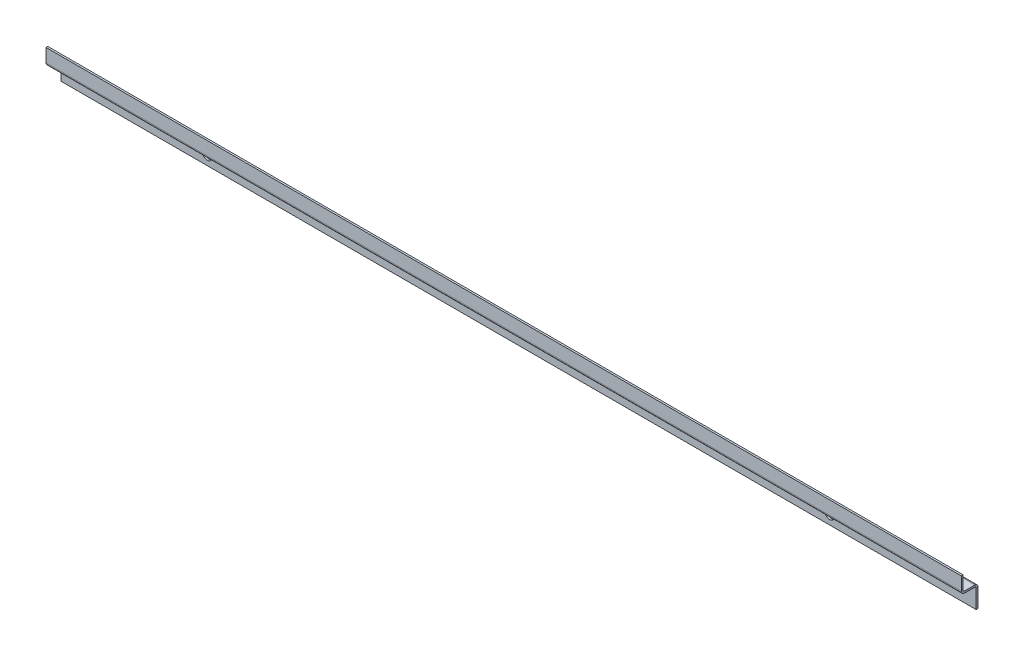
ISO-10303-21;
HEADER;
FILE_DESCRIPTION(('STEP AP214'),'2;1');
FILE_NAME('part.step','',(''),(''),'','','');
FILE_SCHEMA(('AUTOMOTIVE_DESIGN { 1 0 10303 214 1 1 1 1 }'));
ENDSEC;
DATA;
#1=APPLICATION_CONTEXT('core data for automotive mechanical design processes');
#2=APPLICATION_PROTOCOL_DEFINITION('international standard','automotive_design',2000,#1);
#3=PRODUCT_CONTEXT('',#1,'mechanical');
#4=PRODUCT('Part','Part','',(#3));
#5=PRODUCT_RELATED_PRODUCT_CATEGORY('part','',(#4));
#6=PRODUCT_DEFINITION_FORMATION('','',#4);
#7=PRODUCT_DEFINITION_CONTEXT('part definition',#1,'design');
#8=PRODUCT_DEFINITION('design','',#6,#7);
#9=PRODUCT_DEFINITION_SHAPE('','',#8);
#10=(LENGTH_UNIT() NAMED_UNIT(*) SI_UNIT(.MILLI.,.METRE.));
#11=(NAMED_UNIT(*) PLANE_ANGLE_UNIT() SI_UNIT($,.RADIAN.));
#12=(NAMED_UNIT(*) SI_UNIT($,.STERADIAN.) SOLID_ANGLE_UNIT());
#13=UNCERTAINTY_MEASURE_WITH_UNIT(LENGTH_MEASURE(1.E-05),#10,'distance_accuracy_value','');
#14=(GEOMETRIC_REPRESENTATION_CONTEXT(3) GLOBAL_UNCERTAINTY_ASSIGNED_CONTEXT((#13)) GLOBAL_UNIT_ASSIGNED_CONTEXT((#10,
#11,#12)) REPRESENTATION_CONTEXT('',''));
#15=CARTESIAN_POINT('',(0.,0.,0.));
#16=DIRECTION('',(0.,0.,1.));
#17=DIRECTION('',(1.,0.,0.));
#18=AXIS2_PLACEMENT_3D('',#15,#16,#17);
#19=CARTESIAN_POINT('',(500.,4.2634,-4.05));
#20=DIRECTION('',(1.,0.,0.));
#21=DIRECTION('',(0.,0.,-1.));
#22=AXIS2_PLACEMENT_3D('',#19,#20,#21);
#23=PLANE('',#22);
#24=DIRECTION('',(0.,0.,1.));
#25=VECTOR('',#24,1.);
#26=CARTESIAN_POINT('',(500.,4.2634,-4.05));
#27=LINE('',#26,#25);
#28=CARTESIAN_POINT('',(500.,4.2634,-4.05));
#29=VERTEX_POINT('',#28);
#30=CARTESIAN_POINT('',(500.,4.2634,-3.05));
#31=VERTEX_POINT('',#30);
#32=EDGE_CURVE('E11',#29,#31,#27,.T.);
#33=ORIENTED_EDGE('',*,*,#32,.F.);
#34=CARTESIAN_POINT('',(500.,4.2634,-2.3134));
#35=DIRECTION('',(-1.,0.,0.));
#36=DIRECTION('',(0.,0.,1.));
#37=AXIS2_PLACEMENT_3D('',#34,#35,#36);
#38=CIRCLE('',#37,1.7366);
#39=CARTESIAN_POINT('',(500.,6.,-2.3134));
#40=VERTEX_POINT('',#39);
#41=EDGE_CURVE('E145',#29,#40,#38,.F.);
#42=ORIENTED_EDGE('',*,*,#41,.T.);
#43=DIRECTION('',(0.,1.,0.));
#44=VECTOR('',#43,1.);
#45=CARTESIAN_POINT('',(500.,5.,-2.3134));
#46=LINE('',#45,#44);
#47=CARTESIAN_POINT('',(500.,5.,-2.3134));
#48=VERTEX_POINT('',#47);
#49=EDGE_CURVE('E43',#48,#40,#46,.T.);
#50=ORIENTED_EDGE('',*,*,#49,.F.);
#51=CARTESIAN_POINT('',(500.,4.2634,-2.3134));
#52=DIRECTION('',(1.,0.,0.));
#53=DIRECTION('',(0.,0.,-1.));
#54=AXIS2_PLACEMENT_3D('',#51,#52,#53);
#55=CIRCLE('',#54,0.7366);
#56=EDGE_CURVE('E240',#31,#48,#55,.T.);
#57=ORIENTED_EDGE('',*,*,#56,.F.);
#58=EDGE_LOOP('',(#33,#42,#50,#57));
#59=FACE_BOUND('',#58,.T.);
#60=ADVANCED_FACE('F35',(#59),#23,.T.);
#61=CARTESIAN_POINT('',(500.,5.,-2.3134));
#62=DIRECTION('',(1.,0.,0.));
#63=DIRECTION('',(0.,0.,-1.));
#64=AXIS2_PLACEMENT_3D('',#61,#62,#63);
#65=PLANE('',#64);
#66=DIRECTION('',(0.,1.,0.));
#67=VECTOR('',#66,1.);
#68=CARTESIAN_POINT('',(500.,6.,-4.05));
#69=LINE('',#68,#67);
#70=CARTESIAN_POINT('',(500.,-6.,-4.05));
#71=VERTEX_POINT('',#70);
#72=EDGE_CURVE('E150',#71,#29,#69,.T.);
#73=ORIENTED_EDGE('',*,*,#72,.T.);
#74=ORIENTED_EDGE('',*,*,#32,.T.);
#75=DIRECTION('',(0.,1.,0.));
#76=VECTOR('',#75,1.);
#77=CARTESIAN_POINT('',(500.,6.,-3.05));
#78=LINE('',#77,#76);
#79=CARTESIAN_POINT('',(500.,-6.,-3.05));
#80=VERTEX_POINT('',#79);
#81=EDGE_CURVE('E253',#80,#31,#78,.T.);
#82=ORIENTED_EDGE('',*,*,#81,.F.);
#83=DIRECTION('',(0.,0.,1.));
#84=VECTOR('',#83,1.);
#85=CARTESIAN_POINT('',(500.,-6.,-4.05));
#86=LINE('',#85,#84);
#87=EDGE_CURVE('E255',#71,#80,#86,.T.);
#88=ORIENTED_EDGE('',*,*,#87,.F.);
#89=EDGE_LOOP('',(#73,#74,#82,#88));
#90=FACE_BOUND('',#89,.T.);
#91=ADVANCED_FACE('F266',(#90),#65,.T.);
#92=CARTESIAN_POINT('',(0.,6.,-2.3134));
#93=DIRECTION('',(-1.,0.,0.));
#94=DIRECTION('',(0.,0.,1.));
#95=AXIS2_PLACEMENT_3D('',#92,#93,#94);
#96=PLANE('',#95);
#97=DIRECTION('',(0.,-1.,0.));
#98=VECTOR('',#97,1.);
#99=CARTESIAN_POINT('',(0.,6.,-2.3134));
#100=LINE('',#99,#98);
#101=CARTESIAN_POINT('',(0.,6.,-2.3134));
#102=VERTEX_POINT('',#101);
#103=CARTESIAN_POINT('',(0.,5.,-2.3134));
#104=VERTEX_POINT('',#103);
#105=EDGE_CURVE('E143',#102,#104,#100,.T.);
#106=ORIENTED_EDGE('',*,*,#105,.F.);
#107=CARTESIAN_POINT('',(0.,4.2634,-2.3134));
#108=DIRECTION('',(-1.,0.,0.));
#109=DIRECTION('',(0.,0.,1.));
#110=AXIS2_PLACEMENT_3D('',#107,#108,#109);
#111=CIRCLE('',#110,1.7366);
#112=CARTESIAN_POINT('',(0.,4.2634,-4.05));
#113=VERTEX_POINT('',#112);
#114=EDGE_CURVE('E157',#113,#102,#111,.F.);
#115=ORIENTED_EDGE('',*,*,#114,.F.);
#116=DIRECTION('',(0.,0.,-1.));
#117=VECTOR('',#116,1.);
#118=CARTESIAN_POINT('',(0.,4.2634,-3.05));
#119=LINE('',#118,#117);
#120=CARTESIAN_POINT('',(0.,4.2634,-3.05));
#121=VERTEX_POINT('',#120);
#122=EDGE_CURVE('E231',#121,#113,#119,.T.);
#123=ORIENTED_EDGE('',*,*,#122,.F.);
#124=CARTESIAN_POINT('',(0.,4.2634,-2.3134));
#125=DIRECTION('',(1.,0.,0.));
#126=DIRECTION('',(0.,0.,-1.));
#127=AXIS2_PLACEMENT_3D('',#124,#125,#126);
#128=CIRCLE('',#127,0.7366);
#129=EDGE_CURVE('E185',#121,#104,#128,.T.);
#130=ORIENTED_EDGE('',*,*,#129,.T.);
#131=EDGE_LOOP('',(#106,#115,#123,#130));
#132=FACE_BOUND('',#131,.T.);
#133=ADVANCED_FACE('F245',(#132),#96,.T.);
#134=CARTESIAN_POINT('',(0.,4.2634,-3.05));
#135=DIRECTION('',(-1.,0.,0.));
#136=DIRECTION('',(0.,0.,1.));
#137=AXIS2_PLACEMENT_3D('',#134,#135,#136);
#138=PLANE('',#137);
#139=DIRECTION('',(0.,0.,1.));
#140=VECTOR('',#139,1.);
#141=CARTESIAN_POINT('',(0.,6.,4.05));
#142=LINE('',#141,#140);
#143=CARTESIAN_POINT('',(0.,6.,3.3134));
#144=VERTEX_POINT('',#143);
#145=EDGE_CURVE('E198',#102,#144,#142,.T.);
#146=ORIENTED_EDGE('',*,*,#145,.F.);
#147=ORIENTED_EDGE('',*,*,#105,.T.);
#148=DIRECTION('',(0.,0.,-1.));
#149=VECTOR('',#148,1.);
#150=CARTESIAN_POINT('',(0.,5.,4.05));
#151=LINE('',#150,#149);
#152=CARTESIAN_POINT('',(0.,5.,3.3134));
#153=VERTEX_POINT('',#152);
#154=EDGE_CURVE('E183',#104,#153,#151,.F.);
#155=ORIENTED_EDGE('',*,*,#154,.T.);
#156=DIRECTION('',(0.,1.,0.));
#157=VECTOR('',#156,1.);
#158=CARTESIAN_POINT('',(0.,5.,3.3134));
#159=LINE('',#158,#157);
#160=EDGE_CURVE('E92',#153,#144,#159,.T.);
#161=ORIENTED_EDGE('',*,*,#160,.T.);
#162=EDGE_LOOP('',(#146,#147,#155,#161));
#163=FACE_BOUND('',#162,.T.);
#164=ADVANCED_FACE('F233',(#163),#138,.T.);
#165=CARTESIAN_POINT('',(500.,6.,3.3134));
#166=DIRECTION('',(1.,0.,0.));
#167=DIRECTION('',(0.,0.,-1.));
#168=AXIS2_PLACEMENT_3D('',#165,#166,#167);
#169=PLANE('',#168);
#170=DIRECTION('',(0.,-1.,0.));
#171=VECTOR('',#170,1.);
#172=CARTESIAN_POINT('',(500.,6.,3.3134));
#173=LINE('',#172,#171);
#174=CARTESIAN_POINT('',(500.,6.,3.3134));
#175=VERTEX_POINT('',#174);
#176=CARTESIAN_POINT('',(500.,5.,3.3134));
#177=VERTEX_POINT('',#176);
#178=EDGE_CURVE('E229',#175,#177,#173,.T.);
#179=ORIENTED_EDGE('',*,*,#178,.F.);
#180=CARTESIAN_POINT('',(500.,6.7366,3.3134));
#181=DIRECTION('',(1.,0.,0.));
#182=DIRECTION('',(0.,0.,-1.));
#183=AXIS2_PLACEMENT_3D('',#180,#181,#182);
#184=CIRCLE('',#183,0.7366);
#185=CARTESIAN_POINT('',(500.,6.7366,4.05));
#186=VERTEX_POINT('',#185);
#187=EDGE_CURVE('E165',#175,#186,#184,.F.);
#188=ORIENTED_EDGE('',*,*,#187,.T.);
#189=DIRECTION('',(0.,0.,-1.));
#190=VECTOR('',#189,1.);
#191=CARTESIAN_POINT('',(500.,6.7366,5.05));
#192=LINE('',#191,#190);
#193=CARTESIAN_POINT('',(500.,6.7366,5.05));
#194=VERTEX_POINT('',#193);
#195=EDGE_CURVE('E51',#194,#186,#192,.T.);
#196=ORIENTED_EDGE('',*,*,#195,.F.);
#197=CARTESIAN_POINT('',(500.,6.7366,3.3134));
#198=DIRECTION('',(1.,0.,0.));
#199=DIRECTION('',(0.,0.,-1.));
#200=AXIS2_PLACEMENT_3D('',#197,#198,#199);
#201=CIRCLE('',#200,1.7366);
#202=EDGE_CURVE('E257',#177,#194,#201,.F.);
#203=ORIENTED_EDGE('',*,*,#202,.F.);
#204=EDGE_LOOP('',(#179,#188,#196,#203));
#205=FACE_BOUND('',#204,.T.);
#206=ADVANCED_FACE('F294',(#205),#169,.T.);
#207=CARTESIAN_POINT('',(500.,6.7366,5.05));
#208=DIRECTION('',(1.,0.,0.));
#209=DIRECTION('',(0.,0.,-1.));
#210=AXIS2_PLACEMENT_3D('',#207,#208,#209);
#211=PLANE('',#210);
#212=DIRECTION('',(0.,0.,1.));
#213=VECTOR('',#212,1.);
#214=CARTESIAN_POINT('',(500.,6.,4.05));
#215=LINE('',#214,#213);
#216=EDGE_CURVE('E135',#40,#175,#215,.T.);
#217=ORIENTED_EDGE('',*,*,#216,.T.);
#218=ORIENTED_EDGE('',*,*,#178,.T.);
#219=DIRECTION('',(0.,0.,-1.));
#220=VECTOR('',#219,1.);
#221=CARTESIAN_POINT('',(500.,5.,4.05));
#222=LINE('',#221,#220);
#223=EDGE_CURVE('E138',#48,#177,#222,.F.);
#224=ORIENTED_EDGE('',*,*,#223,.F.);
#225=ORIENTED_EDGE('',*,*,#49,.T.);
#226=EDGE_LOOP('',(#217,#218,#224,#225));
#227=FACE_BOUND('',#226,.T.);
#228=ADVANCED_FACE('F133',(#227),#211,.T.);
#229=CARTESIAN_POINT('',(0.,6.7366,4.05));
#230=DIRECTION('',(-1.,0.,0.));
#231=DIRECTION('',(0.,0.,1.));
#232=AXIS2_PLACEMENT_3D('',#229,#230,#231);
#233=PLANE('',#232);
#234=DIRECTION('',(0.,0.,1.));
#235=VECTOR('',#234,1.);
#236=CARTESIAN_POINT('',(0.,6.7366,4.05));
#237=LINE('',#236,#235);
#238=CARTESIAN_POINT('',(0.,6.7366,4.05));
#239=VERTEX_POINT('',#238);
#240=CARTESIAN_POINT('',(0.,6.7366,5.05));
#241=VERTEX_POINT('',#240);
#242=EDGE_CURVE('E99',#239,#241,#237,.T.);
#243=ORIENTED_EDGE('',*,*,#242,.F.);
#244=CARTESIAN_POINT('',(0.,6.7366,3.3134));
#245=DIRECTION('',(1.,0.,0.));
#246=DIRECTION('',(0.,0.,-1.));
#247=AXIS2_PLACEMENT_3D('',#244,#245,#246);
#248=CIRCLE('',#247,0.7366);
#249=EDGE_CURVE('E200',#144,#239,#248,.F.);
#250=ORIENTED_EDGE('',*,*,#249,.F.);
#251=ORIENTED_EDGE('',*,*,#160,.F.);
#252=CARTESIAN_POINT('',(0.,6.7366,3.3134));
#253=DIRECTION('',(1.,0.,0.));
#254=DIRECTION('',(0.,0.,-1.));
#255=AXIS2_PLACEMENT_3D('',#252,#253,#254);
#256=CIRCLE('',#255,1.7366);
#257=EDGE_CURVE('E181',#153,#241,#256,.F.);
#258=ORIENTED_EDGE('',*,*,#257,.T.);
#259=EDGE_LOOP('',(#243,#250,#251,#258));
#260=FACE_BOUND('',#259,.T.);
#261=ADVANCED_FACE('F300',(#260),#233,.T.);
#262=CARTESIAN_POINT('',(0.,5.,3.3134));
#263=DIRECTION('',(-1.,0.,0.));
#264=DIRECTION('',(0.,0.,1.));
#265=AXIS2_PLACEMENT_3D('',#262,#263,#264);
#266=PLANE('',#265);
#267=DIRECTION('',(0.,1.,0.));
#268=VECTOR('',#267,1.);
#269=CARTESIAN_POINT('',(0.,6.,4.05));
#270=LINE('',#269,#268);
#271=CARTESIAN_POINT('',(0.,14.,4.05));
#272=VERTEX_POINT('',#271);
#273=EDGE_CURVE('E171',#239,#272,#270,.T.);
#274=ORIENTED_EDGE('',*,*,#273,.F.);
#275=ORIENTED_EDGE('',*,*,#242,.T.);
#276=DIRECTION('',(0.,1.,0.));
#277=VECTOR('',#276,1.);
#278=CARTESIAN_POINT('',(0.,6.,5.05));
#279=LINE('',#278,#277);
#280=CARTESIAN_POINT('',(0.,14.,5.05));
#281=VERTEX_POINT('',#280);
#282=EDGE_CURVE('E178',#241,#281,#279,.T.);
#283=ORIENTED_EDGE('',*,*,#282,.T.);
#284=DIRECTION('',(0.,0.,-1.));
#285=VECTOR('',#284,1.);
#286=CARTESIAN_POINT('',(0.,14.,5.05));
#287=LINE('',#286,#285);
#288=EDGE_CURVE('E174',#281,#272,#287,.T.);
#289=ORIENTED_EDGE('',*,*,#288,.T.);
#290=EDGE_LOOP('',(#274,#275,#283,#289));
#291=FACE_BOUND('',#290,.T.);
#292=ADVANCED_FACE('F303',(#291),#266,.T.);
#293=CARTESIAN_POINT('',(500.,6.,4.05));
#294=DIRECTION('',(0.,0.,1.));
#295=DIRECTION('',(1.,0.,0.));
#296=AXIS2_PLACEMENT_3D('',#293,#294,#295);
#297=PLANE('',#296);
#298=ORIENTED_EDGE('',*,*,#273,.T.);
#299=DIRECTION('',(-1.,0.,0.));
#300=VECTOR('',#299,1.);
#301=CARTESIAN_POINT('',(500.,14.,4.05));
#302=LINE('',#301,#300);
#303=CARTESIAN_POINT('',(500.,14.,4.05));
#304=VERTEX_POINT('',#303);
#305=EDGE_CURVE('E224',#304,#272,#302,.T.);
#306=ORIENTED_EDGE('',*,*,#305,.F.);
#307=DIRECTION('',(0.,1.,0.));
#308=VECTOR('',#307,1.);
#309=CARTESIAN_POINT('',(500.,6.,4.05));
#310=LINE('',#309,#308);
#311=EDGE_CURVE('E105',#186,#304,#310,.T.);
#312=ORIENTED_EDGE('',*,*,#311,.F.);
#313=DIRECTION('',(-1.,0.,0.));
#314=VECTOR('',#313,1.);
#315=CARTESIAN_POINT('',(500.,6.7366,4.05));
#316=LINE('',#315,#314);
#317=EDGE_CURVE('E167',#186,#239,#316,.T.);
#318=ORIENTED_EDGE('',*,*,#317,.T.);
#319=EDGE_LOOP('',(#298,#306,#312,#318));
#320=FACE_BOUND('',#319,.T.);
#321=ADVANCED_FACE('F306',(#320),#297,.F.);
#322=CARTESIAN_POINT('',(500.,14.,5.05));
#323=DIRECTION('',(0.,1.,0.));
#324=DIRECTION('',(0.,0.,1.));
#325=AXIS2_PLACEMENT_3D('',#322,#323,#324);
#326=PLANE('',#325);
#327=ORIENTED_EDGE('',*,*,#288,.F.);
#328=DIRECTION('',(-1.,0.,0.));
#329=VECTOR('',#328,1.);
#330=CARTESIAN_POINT('',(500.,14.,5.05));
#331=LINE('',#330,#329);
#332=CARTESIAN_POINT('',(500.,14.,5.05));
#333=VERTEX_POINT('',#332);
#334=EDGE_CURVE('E222',#333,#281,#331,.T.);
#335=ORIENTED_EDGE('',*,*,#334,.F.);
#336=DIRECTION('',(0.,0.,-1.));
#337=VECTOR('',#336,1.);
#338=CARTESIAN_POINT('',(500.,14.,5.05));
#339=LINE('',#338,#337);
#340=EDGE_CURVE('E538',#333,#304,#339,.T.);
#341=ORIENTED_EDGE('',*,*,#340,.T.);
#342=ORIENTED_EDGE('',*,*,#305,.T.);
#343=EDGE_LOOP('',(#327,#335,#341,#342));
#344=FACE_BOUND('',#343,.T.);
#345=ADVANCED_FACE('F310',(#344),#326,.T.);
#346=CARTESIAN_POINT('',(500.,6.,5.05));
#347=DIRECTION('',(0.,0.,1.));
#348=DIRECTION('',(1.,0.,0.));
#349=AXIS2_PLACEMENT_3D('',#346,#347,#348);
#350=PLANE('',#349);
#351=ORIENTED_EDGE('',*,*,#282,.F.);
#352=DIRECTION('',(-1.,0.,0.));
#353=VECTOR('',#352,1.);
#354=CARTESIAN_POINT('',(500.,6.7366,5.05));
#355=LINE('',#354,#353);
#356=EDGE_CURVE('E219',#194,#241,#355,.T.);
#357=ORIENTED_EDGE('',*,*,#356,.F.);
#358=DIRECTION('',(0.,1.,0.));
#359=VECTOR('',#358,1.);
#360=CARTESIAN_POINT('',(500.,6.,5.05));
#361=LINE('',#360,#359);
#362=EDGE_CURVE('E540',#194,#333,#361,.T.);
#363=ORIENTED_EDGE('',*,*,#362,.T.);
#364=ORIENTED_EDGE('',*,*,#334,.T.);
#365=EDGE_LOOP('',(#351,#357,#363,#364));
#366=FACE_BOUND('',#365,.T.);
#367=ADVANCED_FACE('F314',(#366),#350,.T.);
#368=CARTESIAN_POINT('',(500.,6.7366,3.3134));
#369=DIRECTION('',(-1.,0.,0.));
#370=DIRECTION('',(0.,0.,1.));
#371=AXIS2_PLACEMENT_3D('',#368,#369,#370);
#372=CYLINDRICAL_SURFACE('',#371,1.7366);
#373=ORIENTED_EDGE('',*,*,#257,.F.);
#374=DIRECTION('',(-1.,0.,0.));
#375=VECTOR('',#374,1.);
#376=CARTESIAN_POINT('',(500.,5.,3.3134));
#377=LINE('',#376,#375);
#378=EDGE_CURVE('E216',#177,#153,#377,.T.);
#379=ORIENTED_EDGE('',*,*,#378,.F.);
#380=ORIENTED_EDGE('',*,*,#202,.T.);
#381=ORIENTED_EDGE('',*,*,#356,.T.);
#382=EDGE_LOOP('',(#373,#379,#380,#381));
#383=FACE_BOUND('',#382,.T.);
#384=ADVANCED_FACE('F318',(#383),#372,.T.);
#385=CARTESIAN_POINT('',(500.,5.,4.05));
#386=DIRECTION('',(0.,-1.,0.));
#387=DIRECTION('',(0.,0.,-1.));
#388=AXIS2_PLACEMENT_3D('',#385,#386,#387);
#389=PLANE('',#388);
#390=ORIENTED_EDGE('',*,*,#154,.F.);
#391=DIRECTION('',(-1.,0.,0.));
#392=VECTOR('',#391,1.);
#393=CARTESIAN_POINT('',(500.,5.,-2.3134));
#394=LINE('',#393,#392);
#395=EDGE_CURVE('E213',#48,#104,#394,.T.);
#396=ORIENTED_EDGE('',*,*,#395,.F.);
#397=ORIENTED_EDGE('',*,*,#223,.T.);
#398=ORIENTED_EDGE('',*,*,#378,.T.);
#399=EDGE_LOOP('',(#390,#396,#397,#398));
#400=FACE_BOUND('',#399,.T.);
#401=ADVANCED_FACE('F242',(#400),#389,.T.);
#402=CARTESIAN_POINT('',(500.,4.2634,-2.3134));
#403=DIRECTION('',(-1.,0.,0.));
#404=DIRECTION('',(0.,0.,1.));
#405=AXIS2_PLACEMENT_3D('',#402,#403,#404);
#406=CYLINDRICAL_SURFACE('',#405,0.7366);
#407=ORIENTED_EDGE('',*,*,#129,.F.);
#408=DIRECTION('',(-1.,0.,0.));
#409=VECTOR('',#408,1.);
#410=CARTESIAN_POINT('',(500.,4.2634,-3.05));
#411=LINE('',#410,#409);
#412=EDGE_CURVE('E210',#31,#121,#411,.T.);
#413=ORIENTED_EDGE('',*,*,#412,.F.);
#414=ORIENTED_EDGE('',*,*,#56,.T.);
#415=ORIENTED_EDGE('',*,*,#395,.T.);
#416=EDGE_LOOP('',(#407,#413,#414,#415));
#417=FACE_BOUND('',#416,.T.);
#418=ADVANCED_FACE('F238',(#417),#406,.F.);
#419=CARTESIAN_POINT('',(500.,6.,-3.05));
#420=DIRECTION('',(0.,0.,1.));
#421=DIRECTION('',(0.,-1.,0.));
#422=AXIS2_PLACEMENT_3D('',#419,#420,#421);
#423=PLANE('',#422);
#424=CARTESIAN_POINT('',(80.,-0.8683,-3.05));
#425=DIRECTION('',(0.,0.,1.));
#426=DIRECTION('',(0.,-1.,0.));
#427=AXIS2_PLACEMENT_3D('',#424,#425,#426);
#428=CIRCLE('',#427,2.54999999999999);
#429=CARTESIAN_POINT('',(80.,-3.41829999999999,-3.05));
#430=VERTEX_POINT('',#429);
#431=EDGE_CURVE('E553',#430,#430,#428,.T.);
#432=ORIENTED_EDGE('',*,*,#431,.F.);
#433=EDGE_LOOP('',(#432));
#434=FACE_BOUND('',#433,.T.);
#435=CARTESIAN_POINT('',(420.,-0.8683,-3.05));
#436=DIRECTION('',(0.,0.,1.));
#437=DIRECTION('',(0.,-1.,0.));
#438=AXIS2_PLACEMENT_3D('',#435,#436,#437);
#439=CIRCLE('',#438,2.54999999999999);
#440=CARTESIAN_POINT('',(420.,-3.41829999999999,-3.05));
#441=VERTEX_POINT('',#440);
#442=EDGE_CURVE('E175',#441,#441,#439,.T.);
#443=ORIENTED_EDGE('',*,*,#442,.F.);
#444=EDGE_LOOP('',(#443));
#445=FACE_BOUND('',#444,.T.);
#446=DIRECTION('',(0.,1.,0.));
#447=VECTOR('',#446,1.);
#448=CARTESIAN_POINT('',(0.,6.,-3.05));
#449=LINE('',#448,#447);
#450=CARTESIAN_POINT('',(0.,-6.,-3.05));
#451=VERTEX_POINT('',#450);
#452=EDGE_CURVE('E188',#451,#121,#449,.T.);
#453=ORIENTED_EDGE('',*,*,#452,.F.);
#454=DIRECTION('',(-1.,0.,0.));
#455=VECTOR('',#454,1.);
#456=CARTESIAN_POINT('',(500.,-6.,-3.05));
#457=LINE('',#456,#455);
#458=EDGE_CURVE('E208',#80,#451,#457,.T.);
#459=ORIENTED_EDGE('',*,*,#458,.F.);
#460=ORIENTED_EDGE('',*,*,#81,.T.);
#461=ORIENTED_EDGE('',*,*,#412,.T.);
#462=EDGE_LOOP('',(#453,#459,#460,#461));
#463=FACE_BOUND('',#462,.T.);
#464=ADVANCED_FACE('F251',(#434,#445,#463),#423,.T.);
#465=CARTESIAN_POINT('',(500.,-6.,-4.05));
#466=DIRECTION('',(0.,-1.,0.));
#467=DIRECTION('',(0.,0.,-1.));
#468=AXIS2_PLACEMENT_3D('',#465,#466,#467);
#469=PLANE('',#468);
#470=DIRECTION('',(0.,0.,1.));
#471=VECTOR('',#470,1.);
#472=CARTESIAN_POINT('',(0.,-6.,-4.05));
#473=LINE('',#472,#471);
#474=CARTESIAN_POINT('',(0.,-6.,-4.05));
#475=VERTEX_POINT('',#474);
#476=EDGE_CURVE('E191',#475,#451,#473,.T.);
#477=ORIENTED_EDGE('',*,*,#476,.F.);
#478=DIRECTION('',(-1.,0.,0.));
#479=VECTOR('',#478,1.);
#480=CARTESIAN_POINT('',(500.,-6.,-4.05));
#481=LINE('',#480,#479);
#482=EDGE_CURVE('E206',#71,#475,#481,.T.);
#483=ORIENTED_EDGE('',*,*,#482,.F.);
#484=ORIENTED_EDGE('',*,*,#87,.T.);
#485=ORIENTED_EDGE('',*,*,#458,.T.);
#486=EDGE_LOOP('',(#477,#483,#484,#485));
#487=FACE_BOUND('',#486,.T.);
#488=ADVANCED_FACE('F272',(#487),#469,.T.);
#489=CARTESIAN_POINT('',(500.,6.,-4.05));
#490=DIRECTION('',(0.,0.,1.));
#491=DIRECTION('',(0.,-1.,0.));
#492=AXIS2_PLACEMENT_3D('',#489,#490,#491);
#493=PLANE('',#492);
#494=CARTESIAN_POINT('',(80.,-0.8683,-4.05));
#495=DIRECTION('',(0.,0.,-1.));
#496=DIRECTION('',(-1.,0.,0.));
#497=AXIS2_PLACEMENT_3D('',#494,#495,#496);
#498=CIRCLE('',#497,2.54999999999999);
#499=CARTESIAN_POINT('',(77.45,-0.8683,-4.05));
#500=VERTEX_POINT('',#499);
#501=EDGE_CURVE('E556',#500,#500,#498,.T.);
#502=ORIENTED_EDGE('',*,*,#501,.F.);
#503=EDGE_LOOP('',(#502));
#504=FACE_BOUND('',#503,.T.);
#505=CARTESIAN_POINT('',(420.,-0.8683,-4.05));
#506=DIRECTION('',(0.,0.,-1.));
#507=DIRECTION('',(-1.,0.,0.));
#508=AXIS2_PLACEMENT_3D('',#505,#506,#507);
#509=CIRCLE('',#508,2.54999999999999);
#510=CARTESIAN_POINT('',(417.45,-0.8683,-4.05));
#511=VERTEX_POINT('',#510);
#512=EDGE_CURVE('E550',#511,#511,#509,.T.);
#513=ORIENTED_EDGE('',*,*,#512,.F.);
#514=EDGE_LOOP('',(#513));
#515=FACE_BOUND('',#514,.T.);
#516=DIRECTION('',(0.,1.,0.));
#517=VECTOR('',#516,1.);
#518=CARTESIAN_POINT('',(0.,6.,-4.05));
#519=LINE('',#518,#517);
#520=EDGE_CURVE('E194',#475,#113,#519,.T.);
#521=ORIENTED_EDGE('',*,*,#520,.T.);
#522=DIRECTION('',(-1.,0.,0.));
#523=VECTOR('',#522,1.);
#524=CARTESIAN_POINT('',(500.,4.2634,-4.05));
#525=LINE('',#524,#523);
#526=EDGE_CURVE('E159',#29,#113,#525,.T.);
#527=ORIENTED_EDGE('',*,*,#526,.F.);
#528=ORIENTED_EDGE('',*,*,#72,.F.);
#529=ORIENTED_EDGE('',*,*,#482,.T.);
#530=EDGE_LOOP('',(#521,#527,#528,#529));
#531=FACE_BOUND('',#530,.T.);
#532=ADVANCED_FACE('F268',(#504,#515,#531),#493,.F.);
#533=CARTESIAN_POINT('',(500.,4.2634,-2.3134));
#534=DIRECTION('',(-1.,0.,0.));
#535=DIRECTION('',(0.,0.,1.));
#536=AXIS2_PLACEMENT_3D('',#533,#534,#535);
#537=CYLINDRICAL_SURFACE('',#536,1.7366);
#538=ORIENTED_EDGE('',*,*,#114,.T.);
#539=DIRECTION('',(-1.,0.,0.));
#540=VECTOR('',#539,1.);
#541=CARTESIAN_POINT('',(500.,6.,-2.3134));
#542=LINE('',#541,#540);
#543=EDGE_CURVE('E154',#40,#102,#542,.T.);
#544=ORIENTED_EDGE('',*,*,#543,.F.);
#545=ORIENTED_EDGE('',*,*,#41,.F.);
#546=ORIENTED_EDGE('',*,*,#526,.T.);
#547=EDGE_LOOP('',(#538,#544,#545,#546));
#548=FACE_BOUND('',#547,.T.);
#549=ADVANCED_FACE('F155',(#548),#537,.T.);
#550=CARTESIAN_POINT('',(500.,6.,4.05));
#551=DIRECTION('',(0.,-1.,0.));
#552=DIRECTION('',(0.,0.,-1.));
#553=AXIS2_PLACEMENT_3D('',#550,#551,#552);
#554=PLANE('',#553);
#555=ORIENTED_EDGE('',*,*,#145,.T.);
#556=DIRECTION('',(-1.,0.,0.));
#557=VECTOR('',#556,1.);
#558=CARTESIAN_POINT('',(500.,6.,3.3134));
#559=LINE('',#558,#557);
#560=EDGE_CURVE('E160',#175,#144,#559,.T.);
#561=ORIENTED_EDGE('',*,*,#560,.F.);
#562=ORIENTED_EDGE('',*,*,#216,.F.);
#563=ORIENTED_EDGE('',*,*,#543,.T.);
#564=EDGE_LOOP('',(#555,#561,#562,#563));
#565=FACE_BOUND('',#564,.T.);
#566=ADVANCED_FACE('F162',(#565),#554,.F.);
#567=CARTESIAN_POINT('',(500.,6.7366,3.3134));
#568=DIRECTION('',(-1.,0.,0.));
#569=DIRECTION('',(0.,0.,1.));
#570=AXIS2_PLACEMENT_3D('',#567,#568,#569);
#571=CYLINDRICAL_SURFACE('',#570,0.7366);
#572=ORIENTED_EDGE('',*,*,#249,.T.);
#573=ORIENTED_EDGE('',*,*,#317,.F.);
#574=ORIENTED_EDGE('',*,*,#187,.F.);
#575=ORIENTED_EDGE('',*,*,#560,.T.);
#576=EDGE_LOOP('',(#572,#573,#574,#575));
#577=FACE_BOUND('',#576,.T.);
#578=ADVANCED_FACE('F425',(#577),#571,.F.);
#579=CARTESIAN_POINT('',(500.,6.7366,3.3134));
#580=DIRECTION('',(1.,0.,0.));
#581=DIRECTION('',(0.,0.,-1.));
#582=AXIS2_PLACEMENT_3D('',#579,#580,#581);
#583=PLANE('',#582);
#584=ORIENTED_EDGE('',*,*,#311,.T.);
#585=ORIENTED_EDGE('',*,*,#340,.F.);
#586=ORIENTED_EDGE('',*,*,#362,.F.);
#587=ORIENTED_EDGE('',*,*,#195,.T.);
#588=EDGE_LOOP('',(#584,#585,#586,#587));
#589=FACE_BOUND('',#588,.T.);
#590=ADVANCED_FACE('F430',(#589),#583,.T.);
#591=CARTESIAN_POINT('',(0.,6.7366,3.3134));
#592=DIRECTION('',(1.,0.,0.));
#593=DIRECTION('',(0.,0.,-1.));
#594=AXIS2_PLACEMENT_3D('',#591,#592,#593);
#595=PLANE('',#594);
#596=ORIENTED_EDGE('',*,*,#452,.T.);
#597=ORIENTED_EDGE('',*,*,#122,.T.);
#598=ORIENTED_EDGE('',*,*,#520,.F.);
#599=ORIENTED_EDGE('',*,*,#476,.T.);
#600=EDGE_LOOP('',(#596,#597,#598,#599));
#601=FACE_BOUND('',#600,.T.);
#602=ADVANCED_FACE('F270',(#601),#595,.F.);
#603=CARTESIAN_POINT('',(420.,-0.8683,5.05));
#604=DIRECTION('',(0.,0.,-1.));
#605=DIRECTION('',(-1.,0.,0.));
#606=AXIS2_PLACEMENT_3D('',#603,#604,#605);
#607=CYLINDRICAL_SURFACE('',#606,2.54999999999999);
#608=ORIENTED_EDGE('',*,*,#442,.T.);
#609=EDGE_LOOP('',(#608));
#610=FACE_BOUND('',#609,.T.);
#611=ORIENTED_EDGE('',*,*,#512,.T.);
#612=EDGE_LOOP('',(#611));
#613=FACE_BOUND('',#612,.T.);
#614=ADVANCED_FACE('F355',(#610,#613),#607,.F.);
#615=CARTESIAN_POINT('',(80.,-0.8683,5.05));
#616=DIRECTION('',(0.,0.,-1.));
#617=DIRECTION('',(-1.,0.,0.));
#618=AXIS2_PLACEMENT_3D('',#615,#616,#617);
#619=CYLINDRICAL_SURFACE('',#618,2.54999999999999);
#620=ORIENTED_EDGE('',*,*,#431,.T.);
#621=EDGE_LOOP('',(#620));
#622=FACE_BOUND('',#621,.T.);
#623=ORIENTED_EDGE('',*,*,#501,.T.);
#624=EDGE_LOOP('',(#623));
#625=FACE_BOUND('',#624,.T.);
#626=ADVANCED_FACE('F360',(#622,#625),#619,.F.);
#627=CLOSED_SHELL('',(#60,#91,#133,#164,#206,#228,#261,#292,#321,#345,#367,#384,#401,#418,#464,
#488,#532,#549,#566,#578,#590,#602,#614,#626));
#628=MANIFOLD_SOLID_BREP('B2',#627);
#629=ADVANCED_BREP_SHAPE_REPRESENTATION('',(#18,#628),#14);
#630=SHAPE_DEFINITION_REPRESENTATION(#9,#629);
ENDSEC;
END-ISO-10303-21;
